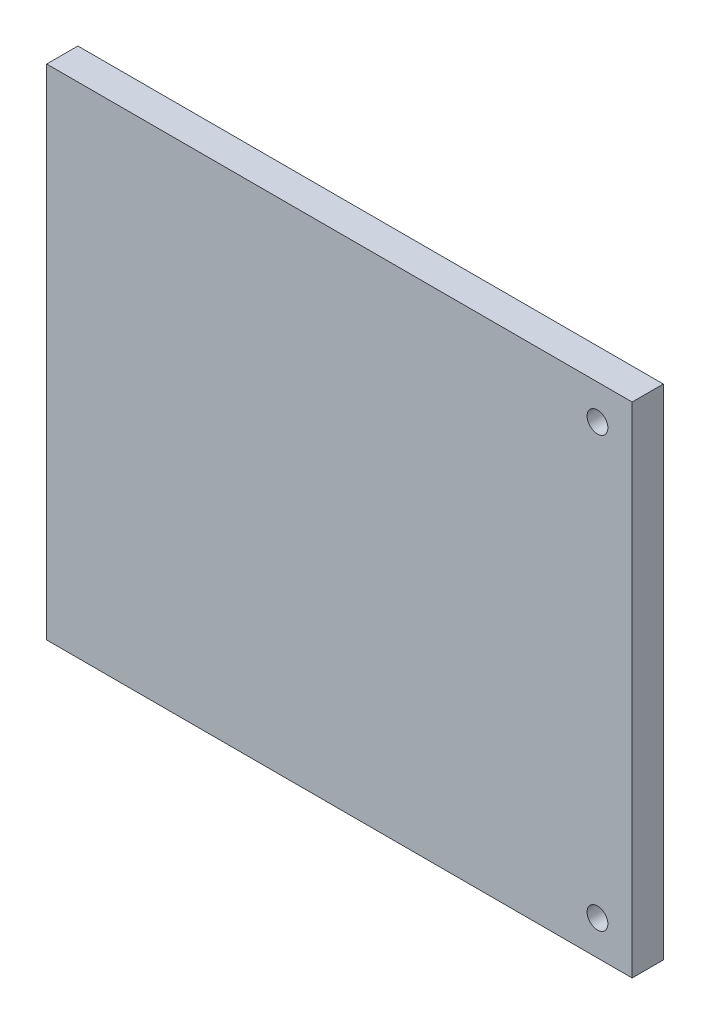
ISO-10303-21;
HEADER;
FILE_DESCRIPTION(('STEP AP214'),'2;1');
FILE_NAME('part.step','',(''),(''),'','','');
FILE_SCHEMA(('AUTOMOTIVE_DESIGN { 1 0 10303 214 1 1 1 1 }'));
ENDSEC;
DATA;
#1=APPLICATION_CONTEXT('core data for automotive mechanical design processes');
#2=APPLICATION_PROTOCOL_DEFINITION('international standard','automotive_design',2000,#1);
#3=PRODUCT_CONTEXT('',#1,'mechanical');
#4=PRODUCT('Part','Part','',(#3));
#5=PRODUCT_RELATED_PRODUCT_CATEGORY('part','',(#4));
#6=PRODUCT_DEFINITION_FORMATION('','',#4);
#7=PRODUCT_DEFINITION_CONTEXT('part definition',#1,'design');
#8=PRODUCT_DEFINITION('design','',#6,#7);
#9=PRODUCT_DEFINITION_SHAPE('','',#8);
#10=(LENGTH_UNIT() NAMED_UNIT(*) SI_UNIT(.MILLI.,.METRE.));
#11=(NAMED_UNIT(*) PLANE_ANGLE_UNIT() SI_UNIT($,.RADIAN.));
#12=(NAMED_UNIT(*) SI_UNIT($,.STERADIAN.) SOLID_ANGLE_UNIT());
#13=UNCERTAINTY_MEASURE_WITH_UNIT(LENGTH_MEASURE(1.E-05),#10,'distance_accuracy_value','');
#14=(GEOMETRIC_REPRESENTATION_CONTEXT(3) GLOBAL_UNCERTAINTY_ASSIGNED_CONTEXT((#13)) GLOBAL_UNIT_ASSIGNED_CONTEXT((#10,
#11,#12)) REPRESENTATION_CONTEXT('',''));
#15=CARTESIAN_POINT('',(0.,0.,0.));
#16=DIRECTION('',(0.,0.,1.));
#17=DIRECTION('',(1.,0.,0.));
#18=AXIS2_PLACEMENT_3D('',#15,#16,#17);
#19=CARTESIAN_POINT('',(-42.25,-36.,4.5));
#20=DIRECTION('',(1.,0.,0.));
#21=DIRECTION('',(0.,0.,-1.));
#22=AXIS2_PLACEMENT_3D('',#19,#20,#21);
#23=PLANE('',#22);
#24=DIRECTION('',(0.,-1.,0.));
#25=VECTOR('',#24,1.);
#26=CARTESIAN_POINT('',(-42.25,-36.,0.));
#27=LINE('',#26,#25);
#28=CARTESIAN_POINT('',(-42.25,36.,0.));
#29=VERTEX_POINT('',#28);
#30=CARTESIAN_POINT('',(-42.25,-36.,0.));
#31=VERTEX_POINT('',#30);
#32=EDGE_CURVE('E96',#29,#31,#27,.T.);
#33=ORIENTED_EDGE('',*,*,#32,.T.);
#34=DIRECTION('',(0.,0.,-1.));
#35=VECTOR('',#34,1.);
#36=CARTESIAN_POINT('',(-42.25,-36.,4.5));
#37=LINE('',#36,#35);
#38=CARTESIAN_POINT('',(-42.25,-36.,4.5));
#39=VERTEX_POINT('',#38);
#40=EDGE_CURVE('E11',#39,#31,#37,.T.);
#41=ORIENTED_EDGE('',*,*,#40,.F.);
#42=DIRECTION('',(0.,-1.,0.));
#43=VECTOR('',#42,1.);
#44=CARTESIAN_POINT('',(-42.25,-36.,4.5));
#45=LINE('',#44,#43);
#46=CARTESIAN_POINT('',(-42.25,36.,4.5));
#47=VERTEX_POINT('',#46);
#48=EDGE_CURVE('E84',#47,#39,#45,.T.);
#49=ORIENTED_EDGE('',*,*,#48,.F.);
#50=DIRECTION('',(0.,0.,-1.));
#51=VECTOR('',#50,1.);
#52=CARTESIAN_POINT('',(-42.25,36.,4.5));
#53=LINE('',#52,#51);
#54=EDGE_CURVE('E92',#47,#29,#53,.T.);
#55=ORIENTED_EDGE('',*,*,#54,.T.);
#56=EDGE_LOOP('',(#33,#41,#49,#55));
#57=FACE_BOUND('',#56,.T.);
#58=ADVANCED_FACE('F33',(#57),#23,.F.);
#59=CARTESIAN_POINT('',(42.25,-36.,4.5));
#60=DIRECTION('',(0.,1.,0.));
#61=DIRECTION('',(-1.,0.,0.));
#62=AXIS2_PLACEMENT_3D('',#59,#60,#61);
#63=PLANE('',#62);
#64=DIRECTION('',(1.,0.,0.));
#65=VECTOR('',#64,1.);
#66=CARTESIAN_POINT('',(42.25,-36.,0.));
#67=LINE('',#66,#65);
#68=CARTESIAN_POINT('',(42.25,-36.,0.));
#69=VERTEX_POINT('',#68);
#70=EDGE_CURVE('E88',#31,#69,#67,.T.);
#71=ORIENTED_EDGE('',*,*,#70,.T.);
#72=DIRECTION('',(0.,0.,-1.));
#73=VECTOR('',#72,1.);
#74=CARTESIAN_POINT('',(42.25,-36.,4.5));
#75=LINE('',#74,#73);
#76=CARTESIAN_POINT('',(42.25,-36.,4.5));
#77=VERTEX_POINT('',#76);
#78=EDGE_CURVE('E41',#77,#69,#75,.T.);
#79=ORIENTED_EDGE('',*,*,#78,.F.);
#80=DIRECTION('',(1.,0.,0.));
#81=VECTOR('',#80,1.);
#82=CARTESIAN_POINT('',(42.25,-36.,4.5));
#83=LINE('',#82,#81);
#84=EDGE_CURVE('E79',#39,#77,#83,.T.);
#85=ORIENTED_EDGE('',*,*,#84,.F.);
#86=ORIENTED_EDGE('',*,*,#40,.T.);
#87=EDGE_LOOP('',(#71,#79,#85,#86));
#88=FACE_BOUND('',#87,.T.);
#89=ADVANCED_FACE('F87',(#88),#63,.F.);
#90=CARTESIAN_POINT('',(42.25,-36.,4.5));
#91=DIRECTION('',(-1.,0.,0.));
#92=DIRECTION('',(0.,0.,1.));
#93=AXIS2_PLACEMENT_3D('',#90,#91,#92);
#94=PLANE('',#93);
#95=DIRECTION('',(0.,1.,0.));
#96=VECTOR('',#95,1.);
#97=CARTESIAN_POINT('',(42.25,-36.,0.));
#98=LINE('',#97,#96);
#99=CARTESIAN_POINT('',(42.25,36.,0.));
#100=VERTEX_POINT('',#99);
#101=EDGE_CURVE('E66',#69,#100,#98,.T.);
#102=ORIENTED_EDGE('',*,*,#101,.T.);
#103=DIRECTION('',(0.,0.,-1.));
#104=VECTOR('',#103,1.);
#105=CARTESIAN_POINT('',(42.25,36.,4.5));
#106=LINE('',#105,#104);
#107=CARTESIAN_POINT('',(42.25,36.,4.5));
#108=VERTEX_POINT('',#107);
#109=EDGE_CURVE('E89',#108,#100,#106,.T.);
#110=ORIENTED_EDGE('',*,*,#109,.F.);
#111=DIRECTION('',(0.,1.,0.));
#112=VECTOR('',#111,1.);
#113=CARTESIAN_POINT('',(42.25,-36.,4.5));
#114=LINE('',#113,#112);
#115=EDGE_CURVE('E82',#77,#108,#114,.T.);
#116=ORIENTED_EDGE('',*,*,#115,.F.);
#117=ORIENTED_EDGE('',*,*,#78,.T.);
#118=EDGE_LOOP('',(#102,#110,#116,#117));
#119=FACE_BOUND('',#118,.T.);
#120=ADVANCED_FACE('F90',(#119),#94,.F.);
#121=CARTESIAN_POINT('',(42.25,36.,4.5));
#122=DIRECTION('',(0.,-1.,0.));
#123=DIRECTION('',(0.,0.,-1.));
#124=AXIS2_PLACEMENT_3D('',#121,#122,#123);
#125=PLANE('',#124);
#126=DIRECTION('',(-1.,0.,0.));
#127=VECTOR('',#126,1.);
#128=CARTESIAN_POINT('',(42.25,36.,0.));
#129=LINE('',#128,#127);
#130=EDGE_CURVE('E72',#100,#29,#129,.T.);
#131=ORIENTED_EDGE('',*,*,#130,.T.);
#132=ORIENTED_EDGE('',*,*,#54,.F.);
#133=DIRECTION('',(-1.,0.,0.));
#134=VECTOR('',#133,1.);
#135=CARTESIAN_POINT('',(42.25,36.,4.5));
#136=LINE('',#135,#134);
#137=EDGE_CURVE('E49',#108,#47,#136,.T.);
#138=ORIENTED_EDGE('',*,*,#137,.F.);
#139=ORIENTED_EDGE('',*,*,#109,.T.);
#140=EDGE_LOOP('',(#131,#132,#138,#139));
#141=FACE_BOUND('',#140,.T.);
#142=ADVANCED_FACE('F104',(#141),#125,.F.);
#143=CARTESIAN_POINT('',(0.,0.,4.5));
#144=DIRECTION('',(0.,0.,1.));
#145=DIRECTION('',(1.,0.,0.));
#146=AXIS2_PLACEMENT_3D('',#143,#144,#145);
#147=PLANE('',#146);
#148=CARTESIAN_POINT('',(37.25,-31.,4.5));
#149=DIRECTION('',(0.,0.,-1.));
#150=DIRECTION('',(-1.,0.,0.));
#151=AXIS2_PLACEMENT_3D('',#148,#149,#150);
#152=CIRCLE('',#151,1.5);
#153=CARTESIAN_POINT('',(35.75,-31.,4.5));
#154=VERTEX_POINT('',#153);
#155=EDGE_CURVE('E113',#154,#154,#152,.T.);
#156=ORIENTED_EDGE('',*,*,#155,.T.);
#157=EDGE_LOOP('',(#156));
#158=FACE_BOUND('',#157,.T.);
#159=CARTESIAN_POINT('',(37.25,31.,4.5));
#160=DIRECTION('',(0.,0.,-1.));
#161=DIRECTION('',(-1.,0.,0.));
#162=AXIS2_PLACEMENT_3D('',#159,#160,#161);
#163=CIRCLE('',#162,1.5);
#164=CARTESIAN_POINT('',(35.75,31.,4.5));
#165=VERTEX_POINT('',#164);
#166=EDGE_CURVE('E99',#165,#165,#163,.T.);
#167=ORIENTED_EDGE('',*,*,#166,.T.);
#168=EDGE_LOOP('',(#167));
#169=FACE_BOUND('',#168,.T.);
#170=ORIENTED_EDGE('',*,*,#48,.T.);
#171=ORIENTED_EDGE('',*,*,#84,.T.);
#172=ORIENTED_EDGE('',*,*,#115,.T.);
#173=ORIENTED_EDGE('',*,*,#137,.T.);
#174=EDGE_LOOP('',(#170,#171,#172,#173));
#175=FACE_BOUND('',#174,.T.);
#176=ADVANCED_FACE('F80',(#158,#169,#175),#147,.T.);
#177=CARTESIAN_POINT('',(0.,0.,0.));
#178=DIRECTION('',(0.,0.,1.));
#179=DIRECTION('',(1.,0.,0.));
#180=AXIS2_PLACEMENT_3D('',#177,#178,#179);
#181=PLANE('',#180);
#182=CARTESIAN_POINT('',(37.25,-31.,0.));
#183=DIRECTION('',(0.,0.,-1.));
#184=DIRECTION('',(-1.,0.,0.));
#185=AXIS2_PLACEMENT_3D('',#182,#183,#184);
#186=CIRCLE('',#185,1.5);
#187=CARTESIAN_POINT('',(35.75,-31.,0.));
#188=VERTEX_POINT('',#187);
#189=EDGE_CURVE('E116',#188,#188,#186,.T.);
#190=ORIENTED_EDGE('',*,*,#189,.F.);
#191=EDGE_LOOP('',(#190));
#192=FACE_BOUND('',#191,.T.);
#193=CARTESIAN_POINT('',(37.25,31.,0.));
#194=DIRECTION('',(0.,0.,-1.));
#195=DIRECTION('',(-1.,0.,0.));
#196=AXIS2_PLACEMENT_3D('',#193,#194,#195);
#197=CIRCLE('',#196,1.5);
#198=CARTESIAN_POINT('',(35.75,31.,0.));
#199=VERTEX_POINT('',#198);
#200=EDGE_CURVE('E110',#199,#199,#197,.T.);
#201=ORIENTED_EDGE('',*,*,#200,.F.);
#202=EDGE_LOOP('',(#201));
#203=FACE_BOUND('',#202,.T.);
#204=ORIENTED_EDGE('',*,*,#32,.F.);
#205=ORIENTED_EDGE('',*,*,#130,.F.);
#206=ORIENTED_EDGE('',*,*,#101,.F.);
#207=ORIENTED_EDGE('',*,*,#70,.F.);
#208=EDGE_LOOP('',(#204,#205,#206,#207));
#209=FACE_BOUND('',#208,.T.);
#210=ADVANCED_FACE('F107',(#192,#203,#209),#181,.F.);
#211=CARTESIAN_POINT('',(37.25,31.,4.5));
#212=DIRECTION('',(0.,0.,-1.));
#213=DIRECTION('',(-1.,0.,0.));
#214=AXIS2_PLACEMENT_3D('',#211,#212,#213);
#215=CYLINDRICAL_SURFACE('',#214,1.5);
#216=ORIENTED_EDGE('',*,*,#166,.F.);
#217=EDGE_LOOP('',(#216));
#218=FACE_BOUND('',#217,.T.);
#219=ORIENTED_EDGE('',*,*,#200,.T.);
#220=EDGE_LOOP('',(#219));
#221=FACE_BOUND('',#220,.T.);
#222=ADVANCED_FACE('F127',(#218,#221),#215,.F.);
#223=CARTESIAN_POINT('',(37.25,-31.,4.5));
#224=DIRECTION('',(0.,0.,-1.));
#225=DIRECTION('',(-1.,0.,0.));
#226=AXIS2_PLACEMENT_3D('',#223,#224,#225);
#227=CYLINDRICAL_SURFACE('',#226,1.5);
#228=ORIENTED_EDGE('',*,*,#155,.F.);
#229=EDGE_LOOP('',(#228));
#230=FACE_BOUND('',#229,.T.);
#231=ORIENTED_EDGE('',*,*,#189,.T.);
#232=EDGE_LOOP('',(#231));
#233=FACE_BOUND('',#232,.T.);
#234=ADVANCED_FACE('F124',(#230,#233),#227,.F.);
#235=CLOSED_SHELL('',(#58,#89,#120,#142,#176,#210,#222,#234));
#236=MANIFOLD_SOLID_BREP('B2',#235);
#237=ADVANCED_BREP_SHAPE_REPRESENTATION('',(#18,#236),#14);
#238=SHAPE_DEFINITION_REPRESENTATION(#9,#237);
ENDSEC;
END-ISO-10303-21;
